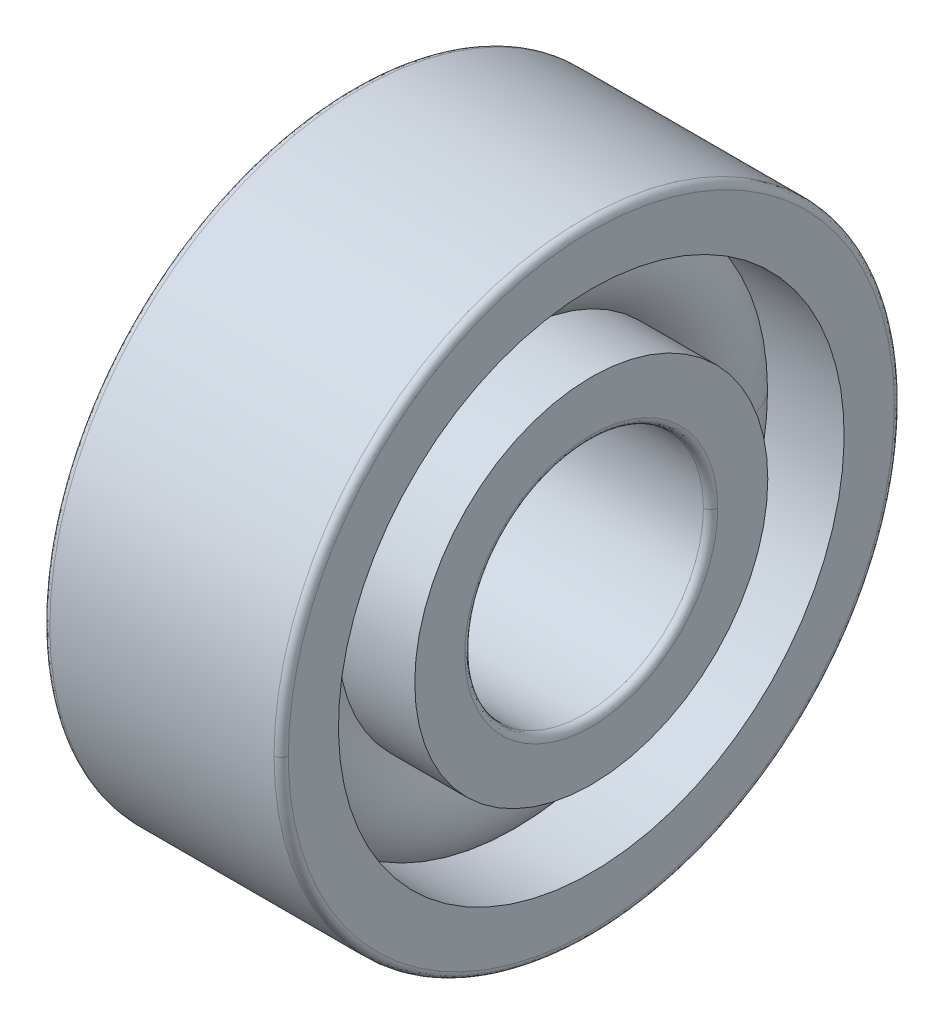
ISO-10303-21;
HEADER;
FILE_DESCRIPTION(('STEP AP214'),'2;1');
FILE_NAME('part.step','',(''),(''),'','','');
FILE_SCHEMA(('AUTOMOTIVE_DESIGN { 1 0 10303 214 1 1 1 1 }'));
ENDSEC;
DATA;
#1=APPLICATION_CONTEXT('core data for automotive mechanical design processes');
#2=APPLICATION_PROTOCOL_DEFINITION('international standard','automotive_design',2000,#1);
#3=PRODUCT_CONTEXT('',#1,'mechanical');
#4=PRODUCT('Part','Part','',(#3));
#5=PRODUCT_RELATED_PRODUCT_CATEGORY('part','',(#4));
#6=PRODUCT_DEFINITION_FORMATION('','',#4);
#7=PRODUCT_DEFINITION_CONTEXT('part definition',#1,'design');
#8=PRODUCT_DEFINITION('design','',#6,#7);
#9=PRODUCT_DEFINITION_SHAPE('','',#8);
#10=(LENGTH_UNIT() NAMED_UNIT(*) SI_UNIT(.MILLI.,.METRE.));
#11=(NAMED_UNIT(*) PLANE_ANGLE_UNIT() SI_UNIT($,.RADIAN.));
#12=(NAMED_UNIT(*) SI_UNIT($,.STERADIAN.) SOLID_ANGLE_UNIT());
#13=UNCERTAINTY_MEASURE_WITH_UNIT(LENGTH_MEASURE(1.E-05),#10,'distance_accuracy_value','');
#14=(GEOMETRIC_REPRESENTATION_CONTEXT(3) GLOBAL_UNCERTAINTY_ASSIGNED_CONTEXT((#13)) GLOBAL_UNIT_ASSIGNED_CONTEXT((#10,
#11,#12)) REPRESENTATION_CONTEXT('',''));
#15=CARTESIAN_POINT('',(0.,0.,0.));
#16=DIRECTION('',(0.,0.,1.));
#17=DIRECTION('',(1.,0.,0.));
#18=AXIS2_PLACEMENT_3D('',#15,#16,#17);
#19=CARTESIAN_POINT('',(4.670049975,0.,-5.00149875));
#20=CARTESIAN_POINT('',(4.670049975,10.002997501,-5.00149875));
#21=CARTESIAN_POINT('',(4.670049975,10.002997501,5.00149875));
#22=CARTESIAN_POINT('',(4.670049975,0.,5.00149875));
#23=CARTESIAN_POINT('',(4.87401613,0.,-4.981033873));
#24=CARTESIAN_POINT('',(4.87401613,9.962067746,-4.981033873));
#25=CARTESIAN_POINT('',(4.87401613,9.962067746,4.981033873));
#26=CARTESIAN_POINT('',(4.87401613,0.,4.981033873));
#27=CARTESIAN_POINT('',(5.018966127,0.,-5.12598387));
#28=CARTESIAN_POINT('',(5.018966127,10.251967741,-5.12598387));
#29=CARTESIAN_POINT('',(5.018966127,10.251967741,5.12598387));
#30=CARTESIAN_POINT('',(5.018966127,0.,5.12598387));
#31=CARTESIAN_POINT('',(4.99850125,0.,-5.329950025));
#32=CARTESIAN_POINT('',(4.99850125,10.65990005,-5.329950025));
#33=CARTESIAN_POINT('',(4.99850125,10.65990005,5.329950025));
#34=CARTESIAN_POINT('',(4.99850125,0.,5.329950025));
#35=(BOUNDED_SURFACE() B_SPLINE_SURFACE(3,3,((#19,#20,#21,#22),(#23,#24,#25,#26),(#27,#28,#29,
#30),(#31,#32,#33,#34)),.UNSPECIFIED.,.F.,.F.,.F.) B_SPLINE_SURFACE_WITH_KNOTS((4,4),(4,4),(0.,
1.),(0.,1.),.UNSPECIFIED.) GEOMETRIC_REPRESENTATION_ITEM() RATIONAL_B_SPLINE_SURFACE(((1.,
0.333333333333333,0.333333333333333,1.),(0.755320871117971,0.25177362370599,0.25177362370599,
0.755320871117971),(0.755320871117971,0.25177362370599,0.25177362370599,0.755320871117971),(1.,
0.333333333333333,0.333333333333333,1.))) REPRESENTATION_ITEM('') SURFACE());
#36=CARTESIAN_POINT('',(4.7,0.,0.));
#37=DIRECTION('',(1.,0.,0.));
#38=DIRECTION('',(0.,0.,-1.));
#39=AXIS2_PLACEMENT_3D('',#36,#37,#38);
#40=CIRCLE('',#39,5.);
#41=CARTESIAN_POINT('',(4.70000000004814,-6.73452213215498E-10,-4.99999999990353));
#42=VERTEX_POINT('',#41);
#43=CARTESIAN_POINT('',(4.70000000004814,-1.53827571386498E-09,4.99999999990353));
#44=VERTEX_POINT('',#43);
#45=EDGE_CURVE('E718',#42,#44,#40,.T.);
#46=CARTESIAN_POINT('',(4.670049975,0.,-5.00149875));
#47=CARTESIAN_POINT('',(4.87401613,0.,-4.981033873));
#48=CARTESIAN_POINT('',(5.018966127,0.,-5.12598387));
#49=CARTESIAN_POINT('',(4.99850125,0.,-5.329950025));
#50=(BOUNDED_CURVE() B_SPLINE_CURVE(3,(#46,#47,#48,#49),.UNSPECIFIED.,.F.,
.F.) B_SPLINE_CURVE_WITH_KNOTS((4,4),(0.,1.),
.UNSPECIFIED.) CURVE() GEOMETRIC_REPRESENTATION_ITEM() RATIONAL_B_SPLINE_CURVE((1.,
0.755320871117971,0.755320871117971,1.)) REPRESENTATION_ITEM(''));
#51=CARTESIAN_POINT('',(5.00000000023152,0.,-5.30000000043888));
#52=VERTEX_POINT('',#51);
#53=EDGE_CURVE('E108',#52,#42,#50,.F.);
#54=CARTESIAN_POINT('',(5.00000000038587,0.,-5.29999999977427));
#55=CARTESIAN_POINT('',(5.00000000038587,10.5999999996801,-5.29999999977427));
#56=CARTESIAN_POINT('',(5.00000000038587,10.5999999996801,5.29999999977427));
#57=CARTESIAN_POINT('',(5.00000000038587,0.,5.29999999977427));
#58=(BOUNDED_CURVE() B_SPLINE_CURVE(3,(#54,#55,#56,#57),.UNSPECIFIED.,.F.,
.F.) B_SPLINE_CURVE_WITH_KNOTS((4,4),(0.,1.),
.UNSPECIFIED.) CURVE() GEOMETRIC_REPRESENTATION_ITEM() RATIONAL_B_SPLINE_CURVE((0.956578302122204,
0.318859434040735,0.318859434040735,0.956578302122204)) REPRESENTATION_ITEM(''));
#59=CARTESIAN_POINT('',(5.00000000023152,0.,5.30000000043888));
#60=VERTEX_POINT('',#59);
#61=EDGE_CURVE('E102',#60,#52,#58,.F.);
#62=CARTESIAN_POINT('',(4.670049975,0.,5.00149875));
#63=CARTESIAN_POINT('',(4.87401613,0.,4.981033873));
#64=CARTESIAN_POINT('',(5.018966127,0.,5.12598387));
#65=CARTESIAN_POINT('',(4.99850125,0.,5.329950025));
#66=(BOUNDED_CURVE() B_SPLINE_CURVE(3,(#62,#63,#64,#65),.UNSPECIFIED.,.F.,
.F.) B_SPLINE_CURVE_WITH_KNOTS((4,4),(0.,1.),
.UNSPECIFIED.) CURVE() GEOMETRIC_REPRESENTATION_ITEM() RATIONAL_B_SPLINE_CURVE((1.,
0.755320871117971,0.755320871117971,1.)) REPRESENTATION_ITEM(''));
#67=EDGE_CURVE('E105',#44,#60,#66,.T.);
#68=ORIENTED_EDGE('',*,*,#45,.F.);
#69=ORIENTED_EDGE('',*,*,#53,.F.);
#70=ORIENTED_EDGE('',*,*,#61,.F.);
#71=ORIENTED_EDGE('',*,*,#67,.F.);
#72=EDGE_LOOP('',(#68,#69,#70,#71));
#73=FACE_BOUND('',#72,.T.);
#74=ADVANCED_FACE('F16',(#73),#35,.T.);
#75=CARTESIAN_POINT('',(4.670049975,0.,5.00149875));
#76=CARTESIAN_POINT('',(4.670049975,-10.002997501,5.00149875));
#77=CARTESIAN_POINT('',(4.670049975,-10.002997501,-5.00149875));
#78=CARTESIAN_POINT('',(4.670049975,0.,-5.00149875));
#79=CARTESIAN_POINT('',(4.87401613,0.,4.981033873));
#80=CARTESIAN_POINT('',(4.87401613,-9.962067746,4.981033873));
#81=CARTESIAN_POINT('',(4.87401613,-9.962067746,-4.981033873));
#82=CARTESIAN_POINT('',(4.87401613,0.,-4.981033873));
#83=CARTESIAN_POINT('',(5.018966127,0.,5.12598387));
#84=CARTESIAN_POINT('',(5.018966127,-10.251967741,5.12598387));
#85=CARTESIAN_POINT('',(5.018966127,-10.251967741,-5.12598387));
#86=CARTESIAN_POINT('',(5.018966127,0.,-5.12598387));
#87=CARTESIAN_POINT('',(4.99850125,0.,5.329950025));
#88=CARTESIAN_POINT('',(4.99850125,-10.65990005,5.329950025));
#89=CARTESIAN_POINT('',(4.99850125,-10.65990005,-5.329950025));
#90=CARTESIAN_POINT('',(4.99850125,0.,-5.329950025));
#91=(BOUNDED_SURFACE() B_SPLINE_SURFACE(3,3,((#75,#76,#77,#78),(#79,#80,#81,#82),(#83,#84,#85,
#86),(#87,#88,#89,#90)),.UNSPECIFIED.,.F.,.F.,.F.) B_SPLINE_SURFACE_WITH_KNOTS((4,4),(4,4),(0.,
1.),(0.,1.),.UNSPECIFIED.) GEOMETRIC_REPRESENTATION_ITEM() RATIONAL_B_SPLINE_SURFACE(((1.,
0.333333333333333,0.333333333333333,1.),(0.755320871117971,0.25177362370599,0.25177362370599,
0.755320871117971),(0.755320871117971,0.25177362370599,0.25177362370599,0.755320871117971),(1.,
0.333333333333333,0.333333333333333,1.))) REPRESENTATION_ITEM('') SURFACE());
#92=CARTESIAN_POINT('',(4.7,0.,0.));
#93=DIRECTION('',(1.,0.,0.));
#94=DIRECTION('',(0.,0.,-1.));
#95=AXIS2_PLACEMENT_3D('',#92,#93,#94);
#96=CIRCLE('',#95,5.);
#97=EDGE_CURVE('E114',#44,#42,#96,.T.);
#98=CARTESIAN_POINT('',(5.00000000038587,0.,5.29999999977428));
#99=CARTESIAN_POINT('',(5.00000000038587,-10.5999999996801,5.29999999977428));
#100=CARTESIAN_POINT('',(5.00000000038587,-10.5999999996801,-5.29999999977428));
#101=CARTESIAN_POINT('',(5.00000000038587,0.,-5.29999999977428));
#102=(BOUNDED_CURVE() B_SPLINE_CURVE(3,(#98,#99,#100,#101),.UNSPECIFIED.,.F.,
.F.) B_SPLINE_CURVE_WITH_KNOTS((4,4),(0.,1.),
.UNSPECIFIED.) CURVE() GEOMETRIC_REPRESENTATION_ITEM() RATIONAL_B_SPLINE_CURVE((0.956578302122207,
0.318859434040735,0.318859434040735,0.956578302122207)) REPRESENTATION_ITEM(''));
#103=EDGE_CURVE('E113',#52,#60,#102,.F.);
#104=ORIENTED_EDGE('',*,*,#53,.T.);
#105=ORIENTED_EDGE('',*,*,#97,.F.);
#106=ORIENTED_EDGE('',*,*,#67,.T.);
#107=ORIENTED_EDGE('',*,*,#103,.F.);
#108=EDGE_LOOP('',(#104,#105,#106,#107));
#109=FACE_BOUND('',#108,.T.);
#110=ADVANCED_FACE('F119',(#109),#91,.T.);
#111=CARTESIAN_POINT('',(-4.7,0.,0.));
#112=DIRECTION('',(1.,0.,0.));
#113=DIRECTION('',(0.,0.,-1.));
#114=AXIS2_PLACEMENT_3D('',#111,#112,#113);
#115=CYLINDRICAL_SURFACE('',#114,5.);
#116=ORIENTED_EDGE('',*,*,#45,.T.);
#117=ORIENTED_EDGE('',*,*,#97,.T.);
#118=EDGE_LOOP('',(#116,#117));
#119=FACE_BOUND('',#118,.T.);
#120=CARTESIAN_POINT('',(-4.70000000019257,0.,0.));
#121=DIRECTION('',(1.,0.,0.));
#122=DIRECTION('',(0.,0.,-1.));
#123=AXIS2_PLACEMENT_3D('',#120,#121,#122);
#124=CIRCLE('',#123,4.99999999961413);
#125=CARTESIAN_POINT('',(-4.70000000019257,-5.12758571288328E-10,4.9999999997106));
#126=VERTEX_POINT('',#125);
#127=CARTESIAN_POINT('',(-4.70000000014443,-2.24484071071833E-10,-4.9999999997106));
#128=VERTEX_POINT('',#127);
#129=EDGE_CURVE('E324',#126,#128,#124,.T.);
#130=ORIENTED_EDGE('',*,*,#129,.F.);
#131=CARTESIAN_POINT('',(-4.70000000019257,0.,0.));
#132=DIRECTION('',(1.,0.,0.));
#133=DIRECTION('',(0.,0.,-1.));
#134=AXIS2_PLACEMENT_3D('',#131,#132,#133);
#135=CIRCLE('',#134,4.99999999961413);
#136=EDGE_CURVE('E126',#128,#126,#135,.T.);
#137=ORIENTED_EDGE('',*,*,#136,.F.);
#138=EDGE_LOOP('',(#130,#137));
#139=FACE_BOUND('',#138,.T.);
#140=ADVANCED_FACE('F147',(#119,#139),#115,.F.);
#141=CARTESIAN_POINT('',(5.,-7.4888,7.4888));
#142=DIRECTION('',(1.,0.,0.));
#143=DIRECTION('',(0.,0.,-1.));
#144=AXIS2_PLACEMENT_3D('',#141,#142,#143);
#145=PLANE('',#144);
#146=ORIENTED_EDGE('',*,*,#61,.T.);
#147=ORIENTED_EDGE('',*,*,#103,.T.);
#148=EDGE_LOOP('',(#146,#147));
#149=FACE_BOUND('',#148,.T.);
#150=CARTESIAN_POINT('',(5.,0.,0.));
#151=DIRECTION('',(1.,0.,0.));
#152=DIRECTION('',(0.,1.,0.));
#153=AXIS2_PLACEMENT_3D('',#150,#151,#152);
#154=CIRCLE('',#153,7.4);
#155=CARTESIAN_POINT('',(5.,7.4,0.));
#156=VERTEX_POINT('',#155);
#157=EDGE_CURVE('E21',#156,#156,#154,.T.);
#158=ORIENTED_EDGE('',*,*,#157,.T.);
#159=EDGE_LOOP('',(#158));
#160=FACE_BOUND('',#159,.T.);
#161=ADVANCED_FACE('F124',(#149,#160),#145,.T.);
#162=CARTESIAN_POINT('',(-4.99850125,0.,-5.329950025));
#163=CARTESIAN_POINT('',(-4.99850125,10.65990005,-5.329950025));
#164=CARTESIAN_POINT('',(-4.99850125,10.65990005,5.329950025));
#165=CARTESIAN_POINT('',(-4.99850125,0.,5.329950025));
#166=CARTESIAN_POINT('',(-5.018966127,0.,-5.12598387));
#167=CARTESIAN_POINT('',(-5.018966127,10.251967741,-5.12598387));
#168=CARTESIAN_POINT('',(-5.018966127,10.251967741,5.12598387));
#169=CARTESIAN_POINT('',(-5.018966127,0.,5.12598387));
#170=CARTESIAN_POINT('',(-4.87401613,0.,-4.981033873));
#171=CARTESIAN_POINT('',(-4.87401613,9.962067746,-4.981033873));
#172=CARTESIAN_POINT('',(-4.87401613,9.962067746,4.981033873));
#173=CARTESIAN_POINT('',(-4.87401613,0.,4.981033873));
#174=CARTESIAN_POINT('',(-4.670049975,0.,-5.00149875));
#175=CARTESIAN_POINT('',(-4.670049975,10.002997501,-5.00149875));
#176=CARTESIAN_POINT('',(-4.670049975,10.002997501,5.00149875));
#177=CARTESIAN_POINT('',(-4.670049975,0.,5.00149875));
#178=(BOUNDED_SURFACE() B_SPLINE_SURFACE(3,3,((#162,#163,#164,#165),(#166,#167,#168,#169),(#170,
#171,#172,#173),(#174,#175,#176,#177)),.UNSPECIFIED.,.F.,.F.,
.F.) B_SPLINE_SURFACE_WITH_KNOTS((4,4),(4,4),(0.,1.),(0.,1.),
.UNSPECIFIED.) GEOMETRIC_REPRESENTATION_ITEM() RATIONAL_B_SPLINE_SURFACE(((1.,0.333333333333333,
0.333333333333333,1.),(0.755320871117971,0.25177362370599,0.25177362370599,0.755320871117971),
(0.755320871117971,0.25177362370599,0.25177362370599,0.755320871117971),(1.,0.333333333333333,
0.333333333333333,1.))) REPRESENTATION_ITEM('') SURFACE());
#179=CARTESIAN_POINT('',(-5.00000000038587,0.,5.29999999977428));
#180=CARTESIAN_POINT('',(-5.00000000038587,10.5999999996801,5.29999999977428));
#181=CARTESIAN_POINT('',(-5.00000000038587,10.5999999996801,-5.29999999977428));
#182=CARTESIAN_POINT('',(-5.00000000038587,0.,-5.29999999977428));
#183=(BOUNDED_CURVE() B_SPLINE_CURVE(3,(#179,#180,#181,#182),.UNSPECIFIED.,.F.,
.F.) B_SPLINE_CURVE_WITH_KNOTS((4,4),(0.,1.),
.UNSPECIFIED.) CURVE() GEOMETRIC_REPRESENTATION_ITEM() RATIONAL_B_SPLINE_CURVE((0.956578302122208,
0.318859434040736,0.318859434040736,0.956578302122208)) REPRESENTATION_ITEM(''));
#184=CARTESIAN_POINT('',(-5.00000000023152,0.,-5.30000000043888));
#185=VERTEX_POINT('',#184);
#186=CARTESIAN_POINT('',(-5.00000000023152,0.,5.30000000043888));
#187=VERTEX_POINT('',#186);
#188=EDGE_CURVE('E456',#185,#187,#183,.F.);
#189=CARTESIAN_POINT('',(-4.99850125,0.,-5.329950025));
#190=CARTESIAN_POINT('',(-5.018966127,0.,-5.12598387));
#191=CARTESIAN_POINT('',(-4.87401613,0.,-4.981033873));
#192=CARTESIAN_POINT('',(-4.670049975,0.,-5.00149875));
#193=(BOUNDED_CURVE() B_SPLINE_CURVE(3,(#189,#190,#191,#192),.UNSPECIFIED.,.F.,
.F.) B_SPLINE_CURVE_WITH_KNOTS((4,4),(0.,1.),
.UNSPECIFIED.) CURVE() GEOMETRIC_REPRESENTATION_ITEM() RATIONAL_B_SPLINE_CURVE((1.,
0.755320871117971,0.755320871117971,1.)) REPRESENTATION_ITEM(''));
#194=EDGE_CURVE('E278',#128,#185,#193,.F.);
#195=CARTESIAN_POINT('',(-4.99850125,0.,5.329950025));
#196=CARTESIAN_POINT('',(-5.018966127,0.,5.12598387));
#197=CARTESIAN_POINT('',(-4.87401613,0.,4.981033873));
#198=CARTESIAN_POINT('',(-4.670049975,0.,5.00149875));
#199=(BOUNDED_CURVE() B_SPLINE_CURVE(3,(#195,#196,#197,#198),.UNSPECIFIED.,.F.,
.F.) B_SPLINE_CURVE_WITH_KNOTS((4,4),(0.,1.),
.UNSPECIFIED.) CURVE() GEOMETRIC_REPRESENTATION_ITEM() RATIONAL_B_SPLINE_CURVE((1.,
0.755320871117971,0.755320871117971,1.)) REPRESENTATION_ITEM(''));
#200=EDGE_CURVE('E321',#187,#126,#199,.T.);
#201=ORIENTED_EDGE('',*,*,#188,.F.);
#202=ORIENTED_EDGE('',*,*,#194,.F.);
#203=ORIENTED_EDGE('',*,*,#136,.T.);
#204=ORIENTED_EDGE('',*,*,#200,.F.);
#205=EDGE_LOOP('',(#201,#202,#203,#204));
#206=FACE_BOUND('',#205,.T.);
#207=ADVANCED_FACE('F146',(#206),#178,.T.);
#208=CARTESIAN_POINT('',(-4.99850125,0.,5.329950025));
#209=CARTESIAN_POINT('',(-4.99850125,-10.65990005,5.329950025));
#210=CARTESIAN_POINT('',(-4.99850125,-10.65990005,-5.329950025));
#211=CARTESIAN_POINT('',(-4.99850125,0.,-5.329950025));
#212=CARTESIAN_POINT('',(-5.018966127,0.,5.12598387));
#213=CARTESIAN_POINT('',(-5.018966127,-10.251967741,5.12598387));
#214=CARTESIAN_POINT('',(-5.018966127,-10.251967741,-5.12598387));
#215=CARTESIAN_POINT('',(-5.018966127,0.,-5.12598387));
#216=CARTESIAN_POINT('',(-4.87401613,0.,4.981033873));
#217=CARTESIAN_POINT('',(-4.87401613,-9.962067746,4.981033873));
#218=CARTESIAN_POINT('',(-4.87401613,-9.962067746,-4.981033873));
#219=CARTESIAN_POINT('',(-4.87401613,0.,-4.981033873));
#220=CARTESIAN_POINT('',(-4.670049975,0.,5.00149875));
#221=CARTESIAN_POINT('',(-4.670049975,-10.002997501,5.00149875));
#222=CARTESIAN_POINT('',(-4.670049975,-10.002997501,-5.00149875));
#223=CARTESIAN_POINT('',(-4.670049975,0.,-5.00149875));
#224=(BOUNDED_SURFACE() B_SPLINE_SURFACE(3,3,((#208,#209,#210,#211),(#212,#213,#214,#215),(#216,
#217,#218,#219),(#220,#221,#222,#223)),.UNSPECIFIED.,.F.,.F.,
.F.) B_SPLINE_SURFACE_WITH_KNOTS((4,4),(4,4),(0.,1.),(0.,1.),
.UNSPECIFIED.) GEOMETRIC_REPRESENTATION_ITEM() RATIONAL_B_SPLINE_SURFACE(((1.,0.333333333333333,
0.333333333333333,1.),(0.755320871117971,0.25177362370599,0.25177362370599,0.755320871117971),
(0.755320871117971,0.25177362370599,0.25177362370599,0.755320871117971),(1.,0.333333333333333,
0.333333333333333,1.))) REPRESENTATION_ITEM('') SURFACE());
#225=CARTESIAN_POINT('',(-5.00000000038587,0.,-5.29999999977428));
#226=CARTESIAN_POINT('',(-5.00000000038587,-10.5999999996801,-5.29999999977428));
#227=CARTESIAN_POINT('',(-5.00000000038587,-10.5999999996801,5.29999999977428));
#228=CARTESIAN_POINT('',(-5.00000000038587,0.,5.29999999977428));
#229=(BOUNDED_CURVE() B_SPLINE_CURVE(3,(#225,#226,#227,#228),.UNSPECIFIED.,.F.,
.F.) B_SPLINE_CURVE_WITH_KNOTS((4,4),(0.,1.),
.UNSPECIFIED.) CURVE() GEOMETRIC_REPRESENTATION_ITEM() RATIONAL_B_SPLINE_CURVE((0.956578302122206,
0.318859434040735,0.318859434040735,0.956578302122206)) REPRESENTATION_ITEM(''));
#230=EDGE_CURVE('E264',#187,#185,#229,.F.);
#231=ORIENTED_EDGE('',*,*,#194,.T.);
#232=ORIENTED_EDGE('',*,*,#230,.F.);
#233=ORIENTED_EDGE('',*,*,#200,.T.);
#234=ORIENTED_EDGE('',*,*,#129,.T.);
#235=EDGE_LOOP('',(#231,#232,#233,#234));
#236=FACE_BOUND('',#235,.T.);
#237=ADVANCED_FACE('F280',(#236),#224,.T.);
#238=CARTESIAN_POINT('',(1.788854382,0.,0.));
#239=DIRECTION('',(1.,0.,0.));
#240=DIRECTION('',(0.,1.,0.));
#241=AXIS2_PLACEMENT_3D('',#238,#239,#240);
#242=CYLINDRICAL_SURFACE('',#241,7.4);
#243=CARTESIAN_POINT('',(1.78885438173406,0.,0.));
#244=DIRECTION('',(-1.,0.,0.));
#245=DIRECTION('',(0.,-1.,0.));
#246=AXIS2_PLACEMENT_3D('',#243,#244,#245);
#247=CIRCLE('',#246,7.39999999949192);
#248=CARTESIAN_POINT('',(1.78885438173406,-3.32236425186312E-10,-7.39999999961894));
#249=VERTEX_POINT('',#248);
#250=CARTESIAN_POINT('',(1.78885438180055,-7.58882685506725E-10,7.39999999961894));
#251=VERTEX_POINT('',#250);
#252=EDGE_CURVE('E240',#249,#251,#247,.T.);
#253=ORIENTED_EDGE('',*,*,#252,.F.);
#254=CARTESIAN_POINT('',(1.78885438173406,0.,0.));
#255=DIRECTION('',(-1.,0.,0.));
#256=DIRECTION('',(0.,-1.,0.));
#257=AXIS2_PLACEMENT_3D('',#254,#255,#256);
#258=CIRCLE('',#257,7.39999999949192);
#259=EDGE_CURVE('E259',#251,#249,#258,.T.);
#260=ORIENTED_EDGE('',*,*,#259,.F.);
#261=EDGE_LOOP('',(#253,#260));
#262=FACE_BOUND('',#261,.T.);
#263=ORIENTED_EDGE('',*,*,#157,.F.);
#264=EDGE_LOOP('',(#263));
#265=FACE_BOUND('',#264,.T.);
#266=ADVANCED_FACE('F157',(#262,#265),#242,.T.);
#267=CARTESIAN_POINT('',(-5.,-7.4888,-7.4888));
#268=DIRECTION('',(-1.,0.,0.));
#269=DIRECTION('',(0.,0.,1.));
#270=AXIS2_PLACEMENT_3D('',#267,#268,#269);
#271=PLANE('',#270);
#272=ORIENTED_EDGE('',*,*,#188,.T.);
#273=ORIENTED_EDGE('',*,*,#230,.T.);
#274=EDGE_LOOP('',(#272,#273));
#275=FACE_BOUND('',#274,.T.);
#276=CARTESIAN_POINT('',(-5.,0.,0.));
#277=DIRECTION('',(1.,0.,0.));
#278=DIRECTION('',(0.,1.,0.));
#279=AXIS2_PLACEMENT_3D('',#276,#277,#278);
#280=CIRCLE('',#279,7.4);
#281=CARTESIAN_POINT('',(-5.,7.4,0.));
#282=VERTEX_POINT('',#281);
#283=EDGE_CURVE('E230',#282,#282,#280,.F.);
#284=ORIENTED_EDGE('',*,*,#283,.T.);
#285=EDGE_LOOP('',(#284));
#286=FACE_BOUND('',#285,.T.);
#287=ADVANCED_FACE('F152',(#275,#286),#271,.T.);
#288=CARTESIAN_POINT('',(1.620184095,0.,10.770594109));
#289=CARTESIAN_POINT('',(1.620184095,21.541188219,10.770594109));
#290=CARTESIAN_POINT('',(1.620184095,21.541188219,-10.770594109));
#291=CARTESIAN_POINT('',(1.620184095,0.,-10.770594109));
#292=CARTESIAN_POINT('',(2.731814894,0.,9.753395119));
#293=CARTESIAN_POINT('',(2.731814894,19.506790238,9.753395119));
#294=CARTESIAN_POINT('',(2.731814894,19.506790238,-9.753395119));
#295=CARTESIAN_POINT('',(2.731814894,0.,-9.753395119));
#296=CARTESIAN_POINT('',(2.731814894,0.,8.246604881));
#297=CARTESIAN_POINT('',(2.731814894,16.493209762,8.246604881));
#298=CARTESIAN_POINT('',(2.731814894,16.493209762,-8.246604881));
#299=CARTESIAN_POINT('',(2.731814894,0.,-8.246604881));
#300=CARTESIAN_POINT('',(1.620184095,0.,7.229405891));
#301=CARTESIAN_POINT('',(1.620184095,14.458811781,7.229405891));
#302=CARTESIAN_POINT('',(1.620184095,14.458811781,-7.229405891));
#303=CARTESIAN_POINT('',(1.620184095,0.,-7.229405891));
#304=(BOUNDED_SURFACE() B_SPLINE_SURFACE(3,3,((#288,#289,#290,#291),(#292,#293,#294,#295),(#296,
#297,#298,#299),(#300,#301,#302,#303)),.UNSPECIFIED.,.F.,.F.,
.F.) B_SPLINE_SURFACE_WITH_KNOTS((4,4),(4,4),(0.,1.),(0.,1.),
.UNSPECIFIED.) GEOMETRIC_REPRESENTATION_ITEM() RATIONAL_B_SPLINE_SURFACE(((1.,0.333333333333333,
0.333333333333333,1.),(0.783384470702987,0.261128156900996,0.261128156900996,0.783384470702987),
(0.783384470702987,0.261128156900996,0.261128156900996,0.783384470702987),(1.,0.333333333333333,
0.333333333333333,1.))) REPRESENTATION_ITEM('') SURFACE());
#305=CARTESIAN_POINT('',(1.788854382,0.,0.));
#306=DIRECTION('',(1.,0.,0.));
#307=DIRECTION('',(0.,0.,-1.));
#308=AXIS2_PLACEMENT_3D('',#305,#306,#307);
#309=CIRCLE('',#308,10.6);
#310=CARTESIAN_POINT('',(1.78885438193351,-3.26114451339377E-09,10.600000000127));
#311=VERTEX_POINT('',#310);
#312=CARTESIAN_POINT('',(1.78885438193351,-1.42771869201686E-09,-10.600000000127));
#313=VERTEX_POINT('',#312);
#314=EDGE_CURVE('E232',#311,#313,#309,.F.);
#315=CARTESIAN_POINT('',(1.620184095,0.,10.770594109));
#316=CARTESIAN_POINT('',(2.731814894,0.,9.753395119));
#317=CARTESIAN_POINT('',(2.731814894,0.,8.246604881));
#318=CARTESIAN_POINT('',(1.620184095,0.,7.229405891));
#319=(BOUNDED_CURVE() B_SPLINE_CURVE(3,(#315,#316,#317,#318),.UNSPECIFIED.,.F.,
.F.) B_SPLINE_CURVE_WITH_KNOTS((4,4),(0.,1.),
.UNSPECIFIED.) CURVE() GEOMETRIC_REPRESENTATION_ITEM() RATIONAL_B_SPLINE_CURVE((1.,
0.783384470702987,0.783384470702987,1.)) REPRESENTATION_ITEM(''));
#320=EDGE_CURVE('E233',#251,#311,#319,.F.);
#321=CARTESIAN_POINT('',(1.620184095,0.,-10.770594109));
#322=CARTESIAN_POINT('',(2.731814894,0.,-9.753395119));
#323=CARTESIAN_POINT('',(2.731814894,0.,-8.246604881));
#324=CARTESIAN_POINT('',(1.620184095,0.,-7.229405891));
#325=(BOUNDED_CURVE() B_SPLINE_CURVE(3,(#321,#322,#323,#324),.UNSPECIFIED.,.F.,
.F.) B_SPLINE_CURVE_WITH_KNOTS((4,4),(0.,1.),
.UNSPECIFIED.) CURVE() GEOMETRIC_REPRESENTATION_ITEM() RATIONAL_B_SPLINE_CURVE((1.,
0.783384470702987,0.783384470702987,1.)) REPRESENTATION_ITEM(''));
#326=EDGE_CURVE('E247',#313,#249,#325,.T.);
#327=ORIENTED_EDGE('',*,*,#314,.F.);
#328=ORIENTED_EDGE('',*,*,#320,.F.);
#329=ORIENTED_EDGE('',*,*,#259,.T.);
#330=ORIENTED_EDGE('',*,*,#326,.F.);
#331=EDGE_LOOP('',(#327,#328,#329,#330));
#332=FACE_BOUND('',#331,.T.);
#333=ADVANCED_FACE('F156',(#332),#304,.T.);
#334=CARTESIAN_POINT('',(1.620184095,0.,-10.770594109));
#335=CARTESIAN_POINT('',(1.620184095,-21.541188219,-10.770594109));
#336=CARTESIAN_POINT('',(1.620184095,-21.541188219,10.770594109));
#337=CARTESIAN_POINT('',(1.620184095,0.,10.770594109));
#338=CARTESIAN_POINT('',(2.731814894,0.,-9.753395119));
#339=CARTESIAN_POINT('',(2.731814894,-19.506790238,-9.753395119));
#340=CARTESIAN_POINT('',(2.731814894,-19.506790238,9.753395119));
#341=CARTESIAN_POINT('',(2.731814894,0.,9.753395119));
#342=CARTESIAN_POINT('',(2.731814894,0.,-8.246604881));
#343=CARTESIAN_POINT('',(2.731814894,-16.493209762,-8.246604881));
#344=CARTESIAN_POINT('',(2.731814894,-16.493209762,8.246604881));
#345=CARTESIAN_POINT('',(2.731814894,0.,8.246604881));
#346=CARTESIAN_POINT('',(1.620184095,0.,-7.229405891));
#347=CARTESIAN_POINT('',(1.620184095,-14.458811781,-7.229405891));
#348=CARTESIAN_POINT('',(1.620184095,-14.458811781,7.229405891));
#349=CARTESIAN_POINT('',(1.620184095,0.,7.229405891));
#350=(BOUNDED_SURFACE() B_SPLINE_SURFACE(3,3,((#334,#335,#336,#337),(#338,#339,#340,#341),(#342,
#343,#344,#345),(#346,#347,#348,#349)),.UNSPECIFIED.,.F.,.F.,
.F.) B_SPLINE_SURFACE_WITH_KNOTS((4,4),(4,4),(0.,1.),(0.,1.),
.UNSPECIFIED.) GEOMETRIC_REPRESENTATION_ITEM() RATIONAL_B_SPLINE_SURFACE(((1.,0.333333333333333,
0.333333333333333,1.),(0.783384470702987,0.261128156900996,0.261128156900996,0.783384470702987),
(0.783384470702987,0.261128156900996,0.261128156900996,0.783384470702987),(1.,0.333333333333333,
0.333333333333333,1.))) REPRESENTATION_ITEM('') SURFACE());
#351=CARTESIAN_POINT('',(1.788854382,0.,0.));
#352=DIRECTION('',(1.,0.,0.));
#353=DIRECTION('',(0.,0.,-1.));
#354=AXIS2_PLACEMENT_3D('',#351,#352,#353);
#355=CIRCLE('',#354,10.6);
#356=EDGE_CURVE('E237',#313,#311,#355,.F.);
#357=ORIENTED_EDGE('',*,*,#320,.T.);
#358=ORIENTED_EDGE('',*,*,#356,.F.);
#359=ORIENTED_EDGE('',*,*,#326,.T.);
#360=ORIENTED_EDGE('',*,*,#252,.T.);
#361=EDGE_LOOP('',(#357,#358,#359,#360));
#362=FACE_BOUND('',#361,.T.);
#363=ADVANCED_FACE('F448',(#362),#350,.T.);
#364=CARTESIAN_POINT('',(-5.,0.,0.));
#365=DIRECTION('',(1.,0.,0.));
#366=DIRECTION('',(0.,1.,0.));
#367=AXIS2_PLACEMENT_3D('',#364,#365,#366);
#368=CYLINDRICAL_SURFACE('',#367,7.4);
#369=ORIENTED_EDGE('',*,*,#283,.F.);
#370=EDGE_LOOP('',(#369));
#371=FACE_BOUND('',#370,.T.);
#372=CARTESIAN_POINT('',(-1.78885438173406,0.,0.));
#373=DIRECTION('',(1.,0.,0.));
#374=DIRECTION('',(0.,1.,0.));
#375=AXIS2_PLACEMENT_3D('',#372,#373,#374);
#376=CIRCLE('',#375,7.39999999949192);
#377=CARTESIAN_POINT('',(-1.78885438173406,-4.98354637773766E-10,-7.39999999961894));
#378=VERTEX_POINT('',#377);
#379=CARTESIAN_POINT('',(-1.78885438173406,-7.58882685506725E-10,7.39999999961894));
#380=VERTEX_POINT('',#379);
#381=EDGE_CURVE('E428',#378,#380,#376,.T.);
#382=ORIENTED_EDGE('',*,*,#381,.F.);
#383=CARTESIAN_POINT('',(-1.78885438173406,0.,0.));
#384=DIRECTION('',(1.,0.,0.));
#385=DIRECTION('',(0.,1.,0.));
#386=AXIS2_PLACEMENT_3D('',#383,#384,#385);
#387=CIRCLE('',#386,7.39999999949192);
#388=EDGE_CURVE('E229',#380,#378,#387,.T.);
#389=ORIENTED_EDGE('',*,*,#388,.F.);
#390=EDGE_LOOP('',(#382,#389));
#391=FACE_BOUND('',#390,.T.);
#392=ADVANCED_FACE('F495',(#371,#391),#368,.T.);
#393=CARTESIAN_POINT('',(1.788854382,0.,0.));
#394=DIRECTION('',(1.,0.,0.));
#395=DIRECTION('',(0.,1.,0.));
#396=AXIS2_PLACEMENT_3D('',#393,#394,#395);
#397=CYLINDRICAL_SURFACE('',#396,10.6);
#398=CARTESIAN_POINT('',(5.,0.,0.));
#399=DIRECTION('',(1.,0.,0.));
#400=DIRECTION('',(0.,1.,0.));
#401=AXIS2_PLACEMENT_3D('',#398,#399,#400);
#402=CIRCLE('',#401,10.6);
#403=CARTESIAN_POINT('',(5.,10.6,0.));
#404=VERTEX_POINT('',#403);
#405=EDGE_CURVE('E227',#404,#404,#402,.F.);
#406=ORIENTED_EDGE('',*,*,#405,.F.);
#407=EDGE_LOOP('',(#406));
#408=FACE_BOUND('',#407,.T.);
#409=ORIENTED_EDGE('',*,*,#356,.T.);
#410=ORIENTED_EDGE('',*,*,#314,.T.);
#411=EDGE_LOOP('',(#409,#410));
#412=FACE_BOUND('',#411,.T.);
#413=ADVANCED_FACE('F502',(#408,#412),#397,.F.);
#414=CARTESIAN_POINT('',(-1.620184095,0.,7.229405891));
#415=CARTESIAN_POINT('',(-1.620184095,14.458811781,7.229405891));
#416=CARTESIAN_POINT('',(-1.620184095,14.458811781,-7.229405891));
#417=CARTESIAN_POINT('',(-1.620184095,0.,-7.229405891));
#418=CARTESIAN_POINT('',(-2.731814894,0.,8.246604881));
#419=CARTESIAN_POINT('',(-2.731814894,16.493209762,8.246604881));
#420=CARTESIAN_POINT('',(-2.731814894,16.493209762,-8.246604881));
#421=CARTESIAN_POINT('',(-2.731814894,0.,-8.246604881));
#422=CARTESIAN_POINT('',(-2.731814894,0.,9.753395119));
#423=CARTESIAN_POINT('',(-2.731814894,19.506790238,9.753395119));
#424=CARTESIAN_POINT('',(-2.731814894,19.506790238,-9.753395119));
#425=CARTESIAN_POINT('',(-2.731814894,0.,-9.753395119));
#426=CARTESIAN_POINT('',(-1.620184095,0.,10.770594109));
#427=CARTESIAN_POINT('',(-1.620184095,21.541188219,10.770594109));
#428=CARTESIAN_POINT('',(-1.620184095,21.541188219,-10.770594109));
#429=CARTESIAN_POINT('',(-1.620184095,0.,-10.770594109));
#430=(BOUNDED_SURFACE() B_SPLINE_SURFACE(3,3,((#414,#415,#416,#417),(#418,#419,#420,#421),(#422,
#423,#424,#425),(#426,#427,#428,#429)),.UNSPECIFIED.,.F.,.F.,
.F.) B_SPLINE_SURFACE_WITH_KNOTS((4,4),(4,4),(0.,1.),(0.,1.),
.UNSPECIFIED.) GEOMETRIC_REPRESENTATION_ITEM() RATIONAL_B_SPLINE_SURFACE(((1.,0.333333333333333,
0.333333333333333,1.),(0.783384470702987,0.261128156900996,0.261128156900996,0.783384470702987),
(0.783384470702987,0.261128156900996,0.261128156900996,0.783384470702987),(1.,0.333333333333333,
0.333333333333333,1.))) REPRESENTATION_ITEM('') SURFACE());
#431=CARTESIAN_POINT('',(-1.620184095,0.,7.229405891));
#432=CARTESIAN_POINT('',(-2.731814894,0.,8.246604881));
#433=CARTESIAN_POINT('',(-2.731814894,0.,9.753395119));
#434=CARTESIAN_POINT('',(-1.620184095,0.,10.770594109));
#435=(BOUNDED_CURVE() B_SPLINE_CURVE(3,(#431,#432,#433,#434),.UNSPECIFIED.,.F.,
.F.) B_SPLINE_CURVE_WITH_KNOTS((4,4),(0.,1.),
.UNSPECIFIED.) CURVE() GEOMETRIC_REPRESENTATION_ITEM() RATIONAL_B_SPLINE_CURVE((1.,
0.783384470702987,0.783384470702987,1.)) REPRESENTATION_ITEM(''));
#436=CARTESIAN_POINT('',(-1.78885438202618,-3.26114451339377E-09,10.6000000000234));
#437=VERTEX_POINT('',#436);
#438=EDGE_CURVE('E440',#437,#380,#435,.F.);
#439=CARTESIAN_POINT('',(-1.788854382,0.,0.));
#440=DIRECTION('',(1.,0.,0.));
#441=DIRECTION('',(0.,0.,-1.));
#442=AXIS2_PLACEMENT_3D('',#439,#440,#441);
#443=CIRCLE('',#442,10.6);
#444=CARTESIAN_POINT('',(-1.78885438193352,-1.42771869201686E-09,-10.600000000127));
#445=VERTEX_POINT('',#444);
#446=EDGE_CURVE('E618',#445,#437,#443,.T.);
#447=CARTESIAN_POINT('',(-1.620184095,0.,-7.229405891));
#448=CARTESIAN_POINT('',(-2.731814894,0.,-8.246604881));
#449=CARTESIAN_POINT('',(-2.731814894,0.,-9.753395119));
#450=CARTESIAN_POINT('',(-1.620184095,0.,-10.770594109));
#451=(BOUNDED_CURVE() B_SPLINE_CURVE(3,(#447,#448,#449,#450),.UNSPECIFIED.,.F.,
.F.) B_SPLINE_CURVE_WITH_KNOTS((4,4),(0.,1.),
.UNSPECIFIED.) CURVE() GEOMETRIC_REPRESENTATION_ITEM() RATIONAL_B_SPLINE_CURVE((1.,
0.783384470702987,0.783384470702987,1.)) REPRESENTATION_ITEM(''));
#452=EDGE_CURVE('E435',#378,#445,#451,.T.);
#453=ORIENTED_EDGE('',*,*,#381,.T.);
#454=ORIENTED_EDGE('',*,*,#438,.F.);
#455=ORIENTED_EDGE('',*,*,#446,.F.);
#456=ORIENTED_EDGE('',*,*,#452,.F.);
#457=EDGE_LOOP('',(#453,#454,#455,#456));
#458=FACE_BOUND('',#457,.T.);
#459=ADVANCED_FACE('F510',(#458),#430,.T.);
#460=CARTESIAN_POINT('',(-1.620184095,0.,-7.229405891));
#461=CARTESIAN_POINT('',(-1.620184095,-14.458811781,-7.229405891));
#462=CARTESIAN_POINT('',(-1.620184095,-14.458811781,7.229405891));
#463=CARTESIAN_POINT('',(-1.620184095,0.,7.229405891));
#464=CARTESIAN_POINT('',(-2.731814894,0.,-8.246604881));
#465=CARTESIAN_POINT('',(-2.731814894,-16.493209762,-8.246604881));
#466=CARTESIAN_POINT('',(-2.731814894,-16.493209762,8.246604881));
#467=CARTESIAN_POINT('',(-2.731814894,0.,8.246604881));
#468=CARTESIAN_POINT('',(-2.731814894,0.,-9.753395119));
#469=CARTESIAN_POINT('',(-2.731814894,-19.506790238,-9.753395119));
#470=CARTESIAN_POINT('',(-2.731814894,-19.506790238,9.753395119));
#471=CARTESIAN_POINT('',(-2.731814894,0.,9.753395119));
#472=CARTESIAN_POINT('',(-1.620184095,0.,-10.770594109));
#473=CARTESIAN_POINT('',(-1.620184095,-21.541188219,-10.770594109));
#474=CARTESIAN_POINT('',(-1.620184095,-21.541188219,10.770594109));
#475=CARTESIAN_POINT('',(-1.620184095,0.,10.770594109));
#476=(BOUNDED_SURFACE() B_SPLINE_SURFACE(3,3,((#460,#461,#462,#463),(#464,#465,#466,#467),(#468,
#469,#470,#471),(#472,#473,#474,#475)),.UNSPECIFIED.,.F.,.F.,
.F.) B_SPLINE_SURFACE_WITH_KNOTS((4,4),(4,4),(0.,1.),(0.,1.),
.UNSPECIFIED.) GEOMETRIC_REPRESENTATION_ITEM() RATIONAL_B_SPLINE_SURFACE(((1.,0.333333333333333,
0.333333333333333,1.),(0.783384470702987,0.261128156900996,0.261128156900996,0.783384470702987),
(0.783384470702987,0.261128156900996,0.261128156900996,0.783384470702987),(1.,0.333333333333333,
0.333333333333333,1.))) REPRESENTATION_ITEM('') SURFACE());
#477=CARTESIAN_POINT('',(-1.788854382,0.,0.));
#478=DIRECTION('',(1.,0.,0.));
#479=DIRECTION('',(0.,0.,-1.));
#480=AXIS2_PLACEMENT_3D('',#477,#478,#479);
#481=CIRCLE('',#480,10.6);
#482=EDGE_CURVE('E590',#437,#445,#481,.T.);
#483=ORIENTED_EDGE('',*,*,#438,.T.);
#484=ORIENTED_EDGE('',*,*,#388,.T.);
#485=ORIENTED_EDGE('',*,*,#452,.T.);
#486=ORIENTED_EDGE('',*,*,#482,.F.);
#487=EDGE_LOOP('',(#483,#484,#485,#486));
#488=FACE_BOUND('',#487,.T.);
#489=ADVANCED_FACE('F413',(#488),#476,.T.);
#490=CARTESIAN_POINT('',(5.,-12.8524,12.8524));
#491=DIRECTION('',(1.,0.,0.));
#492=DIRECTION('',(0.,0.,-1.));
#493=AXIS2_PLACEMENT_3D('',#490,#491,#492);
#494=PLANE('',#493);
#495=ORIENTED_EDGE('',*,*,#405,.T.);
#496=EDGE_LOOP('',(#495));
#497=FACE_BOUND('',#496,.T.);
#498=CARTESIAN_POINT('',(5.00000000038587,0.,12.7000000002257));
#499=CARTESIAN_POINT('',(5.00000000038587,25.4000000003199,12.7000000002257));
#500=CARTESIAN_POINT('',(5.00000000038587,25.4000000003199,-12.7000000002257));
#501=CARTESIAN_POINT('',(5.00000000038587,0.,-12.7000000002257));
#502=(BOUNDED_CURVE() B_SPLINE_CURVE(3,(#498,#499,#500,#501),.UNSPECIFIED.,.F.,
.F.) B_SPLINE_CURVE_WITH_KNOTS((4,4),(0.,1.),
.UNSPECIFIED.) CURVE() GEOMETRIC_REPRESENTATION_ITEM() RATIONAL_B_SPLINE_CURVE((0.95657830212221,
0.318859434040736,0.318859434040736,0.95657830212221)) REPRESENTATION_ITEM(''));
#503=CARTESIAN_POINT('',(5.00000000023152,0.,12.6999999976091));
#504=VERTEX_POINT('',#503);
#505=CARTESIAN_POINT('',(5.00000000023152,0.,-12.6999999976091));
#506=VERTEX_POINT('',#505);
#507=EDGE_CURVE('E179',#504,#506,#502,.T.);
#508=ORIENTED_EDGE('',*,*,#507,.F.);
#509=CARTESIAN_POINT('',(5.00000000038587,0.,-12.7000000002257));
#510=CARTESIAN_POINT('',(5.00000000038587,-25.4000000003199,-12.7000000002257));
#511=CARTESIAN_POINT('',(5.00000000038587,-25.4000000003199,12.7000000002257));
#512=CARTESIAN_POINT('',(5.00000000038587,0.,12.7000000002257));
#513=(BOUNDED_CURVE() B_SPLINE_CURVE(3,(#509,#510,#511,#512),.UNSPECIFIED.,.F.,
.F.) B_SPLINE_CURVE_WITH_KNOTS((4,4),(0.,1.),
.UNSPECIFIED.) CURVE() GEOMETRIC_REPRESENTATION_ITEM() RATIONAL_B_SPLINE_CURVE((0.956578302122207,
0.318859434040735,0.318859434040735,0.956578302122207)) REPRESENTATION_ITEM(''));
#514=EDGE_CURVE('E190',#506,#504,#513,.T.);
#515=ORIENTED_EDGE('',*,*,#514,.F.);
#516=EDGE_LOOP('',(#508,#515));
#517=FACE_BOUND('',#516,.T.);
#518=ADVANCED_FACE('F159',(#497,#517),#494,.T.);
#519=CARTESIAN_POINT('',(4.99850125,0.,12.670049975));
#520=CARTESIAN_POINT('',(4.99850125,-25.34009995,12.670049975));
#521=CARTESIAN_POINT('',(4.99850125,-25.34009995,-12.670049975));
#522=CARTESIAN_POINT('',(4.99850125,0.,-12.670049975));
#523=CARTESIAN_POINT('',(5.018966127,0.,12.87401613));
#524=CARTESIAN_POINT('',(5.018966127,-25.748032259,12.87401613));
#525=CARTESIAN_POINT('',(5.018966127,-25.748032259,-12.87401613));
#526=CARTESIAN_POINT('',(5.018966127,0.,-12.87401613));
#527=CARTESIAN_POINT('',(4.87401613,0.,13.018966127));
#528=CARTESIAN_POINT('',(4.87401613,-26.037932254,13.018966127));
#529=CARTESIAN_POINT('',(4.87401613,-26.037932254,-13.018966127));
#530=CARTESIAN_POINT('',(4.87401613,0.,-13.018966127));
#531=CARTESIAN_POINT('',(4.670049975,0.,12.99850125));
#532=CARTESIAN_POINT('',(4.670049975,-25.997002499,12.99850125));
#533=CARTESIAN_POINT('',(4.670049975,-25.997002499,-12.99850125));
#534=CARTESIAN_POINT('',(4.670049975,0.,-12.99850125));
#535=(BOUNDED_SURFACE() B_SPLINE_SURFACE(3,3,((#519,#520,#521,#522),(#523,#524,#525,#526),(#527,
#528,#529,#530),(#531,#532,#533,#534)),.UNSPECIFIED.,.F.,.F.,
.F.) B_SPLINE_SURFACE_WITH_KNOTS((4,4),(4,4),(0.,1.),(0.,1.),
.UNSPECIFIED.) GEOMETRIC_REPRESENTATION_ITEM() RATIONAL_B_SPLINE_SURFACE(((1.,0.333333333333333,
0.333333333333333,1.),(0.755320871117973,0.251773623705991,0.251773623705991,0.755320871117973),
(0.755320871117973,0.251773623705991,0.251773623705991,0.755320871117973),(1.,0.333333333333333,
0.333333333333333,1.))) REPRESENTATION_ITEM('') SURFACE());
#536=CARTESIAN_POINT('',(4.99850125,0.,-12.670049975));
#537=CARTESIAN_POINT('',(5.018966127,0.,-12.87401613));
#538=CARTESIAN_POINT('',(4.87401613,0.,-13.018966127));
#539=CARTESIAN_POINT('',(4.670049975,0.,-12.99850125));
#540=(BOUNDED_CURVE() B_SPLINE_CURVE(3,(#536,#537,#538,#539),.UNSPECIFIED.,.F.,
.F.) B_SPLINE_CURVE_WITH_KNOTS((4,4),(0.,1.),
.UNSPECIFIED.) CURVE() GEOMETRIC_REPRESENTATION_ITEM() RATIONAL_B_SPLINE_CURVE((1.,
0.755320871117973,0.755320871117973,1.)) REPRESENTATION_ITEM(''));
#541=CARTESIAN_POINT('',(4.70000000012036,-5.83658584786765E-10,-13.0000000002412));
#542=VERTEX_POINT('',#541);
#543=EDGE_CURVE('E595',#506,#542,#540,.T.);
#544=CARTESIAN_POINT('',(4.99850125,0.,12.670049975));
#545=CARTESIAN_POINT('',(5.018966127,0.,12.87401613));
#546=CARTESIAN_POINT('',(4.87401613,0.,13.018966127));
#547=CARTESIAN_POINT('',(4.670049975,0.,12.99850125));
#548=(BOUNDED_CURVE() B_SPLINE_CURVE(3,(#544,#545,#546,#547),.UNSPECIFIED.,.F.,
.F.) B_SPLINE_CURVE_WITH_KNOTS((4,4),(0.,1.),
.UNSPECIFIED.) CURVE() GEOMETRIC_REPRESENTATION_ITEM() RATIONAL_B_SPLINE_CURVE((1.,
0.755320871117973,0.755320871117973,1.)) REPRESENTATION_ITEM(''));
#549=CARTESIAN_POINT('',(4.70000000014443,0.,13.0000000003859));
#550=VERTEX_POINT('',#549);
#551=EDGE_CURVE('E583',#550,#504,#548,.F.);
#552=CARTESIAN_POINT('',(4.7,0.,0.));
#553=DIRECTION('',(1.,0.,0.));
#554=DIRECTION('',(0.,0.,-1.));
#555=AXIS2_PLACEMENT_3D('',#552,#553,#554);
#556=CIRCLE('',#555,13.);
#557=EDGE_CURVE('E601',#550,#542,#556,.T.);
#558=ORIENTED_EDGE('',*,*,#543,.F.);
#559=ORIENTED_EDGE('',*,*,#514,.T.);
#560=ORIENTED_EDGE('',*,*,#551,.F.);
#561=ORIENTED_EDGE('',*,*,#557,.T.);
#562=EDGE_LOOP('',(#558,#559,#560,#561));
#563=FACE_BOUND('',#562,.T.);
#564=ADVANCED_FACE('F401',(#563),#535,.T.);
#565=CARTESIAN_POINT('',(-4.670049975,0.,12.99850125));
#566=CARTESIAN_POINT('',(-4.670049975,-25.997002499,12.99850125));
#567=CARTESIAN_POINT('',(-4.670049975,-25.997002499,-12.99850125));
#568=CARTESIAN_POINT('',(-4.670049975,0.,-12.99850125));
#569=CARTESIAN_POINT('',(-4.87401613,0.,13.018966127));
#570=CARTESIAN_POINT('',(-4.87401613,-26.037932254,13.018966127));
#571=CARTESIAN_POINT('',(-4.87401613,-26.037932254,-13.018966127));
#572=CARTESIAN_POINT('',(-4.87401613,0.,-13.018966127));
#573=CARTESIAN_POINT('',(-5.018966127,0.,12.87401613));
#574=CARTESIAN_POINT('',(-5.018966127,-25.748032259,12.87401613));
#575=CARTESIAN_POINT('',(-5.018966127,-25.748032259,-12.87401613));
#576=CARTESIAN_POINT('',(-5.018966127,0.,-12.87401613));
#577=CARTESIAN_POINT('',(-4.99850125,0.,12.670049975));
#578=CARTESIAN_POINT('',(-4.99850125,-25.34009995,12.670049975));
#579=CARTESIAN_POINT('',(-4.99850125,-25.34009995,-12.670049975));
#580=CARTESIAN_POINT('',(-4.99850125,0.,-12.670049975));
#581=(BOUNDED_SURFACE() B_SPLINE_SURFACE(3,3,((#565,#566,#567,#568),(#569,#570,#571,#572),(#573,
#574,#575,#576),(#577,#578,#579,#580)),.UNSPECIFIED.,.F.,.F.,
.F.) B_SPLINE_SURFACE_WITH_KNOTS((4,4),(4,4),(0.,1.),(0.,1.),
.UNSPECIFIED.) GEOMETRIC_REPRESENTATION_ITEM() RATIONAL_B_SPLINE_SURFACE(((1.,0.333333333333333,
0.333333333333333,1.),(0.755320871117973,0.251773623705991,0.251773623705991,0.755320871117973),
(0.755320871117973,0.251773623705991,0.251773623705991,0.755320871117973),(1.,0.333333333333333,
0.333333333333333,1.))) REPRESENTATION_ITEM('') SURFACE());
#582=CARTESIAN_POINT('',(-4.670049975,0.,-12.99850125));
#583=CARTESIAN_POINT('',(-4.87401613,0.,-13.018966127));
#584=CARTESIAN_POINT('',(-5.018966127,0.,-12.87401613));
#585=CARTESIAN_POINT('',(-4.99850125,0.,-12.670049975));
#586=(BOUNDED_CURVE() B_SPLINE_CURVE(3,(#582,#583,#584,#585),.UNSPECIFIED.,.F.,
.F.) B_SPLINE_CURVE_WITH_KNOTS((4,4),(0.,1.),
.UNSPECIFIED.) CURVE() GEOMETRIC_REPRESENTATION_ITEM() RATIONAL_B_SPLINE_CURVE((1.,
0.755320871117973,0.755320871117973,1.)) REPRESENTATION_ITEM(''));
#587=CARTESIAN_POINT('',(-5.00000000023152,0.,-12.6999999976091));
#588=VERTEX_POINT('',#587);
#589=CARTESIAN_POINT('',(-4.70000000019257,0.,-13.0000000003859));
#590=VERTEX_POINT('',#589);
#591=EDGE_CURVE('E36',#588,#590,#586,.F.);
#592=CARTESIAN_POINT('',(-4.7,0.,0.));
#593=DIRECTION('',(1.,0.,0.));
#594=DIRECTION('',(0.,0.,-1.));
#595=AXIS2_PLACEMENT_3D('',#592,#593,#594);
#596=CIRCLE('',#595,13.);
#597=CARTESIAN_POINT('',(-4.70000000012638,-2.33305149935818E-09,13.0000000001929));
#598=VERTEX_POINT('',#597);
#599=EDGE_CURVE('E615',#590,#598,#596,.F.);
#600=CARTESIAN_POINT('',(-4.670049975,0.,12.99850125));
#601=CARTESIAN_POINT('',(-4.87401613,0.,13.018966127));
#602=CARTESIAN_POINT('',(-5.018966127,0.,12.87401613));
#603=CARTESIAN_POINT('',(-4.99850125,0.,12.670049975));
#604=(BOUNDED_CURVE() B_SPLINE_CURVE(3,(#600,#601,#602,#603),.UNSPECIFIED.,.F.,
.F.) B_SPLINE_CURVE_WITH_KNOTS((4,4),(0.,1.),
.UNSPECIFIED.) CURVE() GEOMETRIC_REPRESENTATION_ITEM() RATIONAL_B_SPLINE_CURVE((1.,
0.755320871117973,0.755320871117973,1.)) REPRESENTATION_ITEM(''));
#605=CARTESIAN_POINT('',(-5.00000000023152,0.,12.6999999976091));
#606=VERTEX_POINT('',#605);
#607=EDGE_CURVE('E386',#598,#606,#604,.T.);
#608=CARTESIAN_POINT('',(-5.00000000038587,0.,12.7000000002257));
#609=CARTESIAN_POINT('',(-5.00000000038587,-25.4000000003199,12.7000000002257));
#610=CARTESIAN_POINT('',(-5.00000000038587,-25.4000000003199,-12.7000000002257));
#611=CARTESIAN_POINT('',(-5.00000000038587,0.,-12.7000000002257));
#612=(BOUNDED_CURVE() B_SPLINE_CURVE(3,(#608,#609,#610,#611),.UNSPECIFIED.,.F.,
.F.) B_SPLINE_CURVE_WITH_KNOTS((4,4),(0.,1.),
.UNSPECIFIED.) CURVE() GEOMETRIC_REPRESENTATION_ITEM() RATIONAL_B_SPLINE_CURVE((0.956578302122211,
0.318859434040737,0.318859434040737,0.956578302122211)) REPRESENTATION_ITEM(''));
#613=EDGE_CURVE('E214',#588,#606,#612,.F.);
#614=ORIENTED_EDGE('',*,*,#591,.T.);
#615=ORIENTED_EDGE('',*,*,#599,.T.);
#616=ORIENTED_EDGE('',*,*,#607,.T.);
#617=ORIENTED_EDGE('',*,*,#613,.F.);
#618=EDGE_LOOP('',(#614,#615,#616,#617));
#619=FACE_BOUND('',#618,.T.);
#620=ADVANCED_FACE('F388',(#619),#581,.T.);
#621=CARTESIAN_POINT('',(-5.,0.,0.));
#622=DIRECTION('',(1.,0.,0.));
#623=DIRECTION('',(0.,1.,0.));
#624=AXIS2_PLACEMENT_3D('',#621,#622,#623);
#625=CYLINDRICAL_SURFACE('',#624,10.6);
#626=ORIENTED_EDGE('',*,*,#446,.T.);
#627=ORIENTED_EDGE('',*,*,#482,.T.);
#628=EDGE_LOOP('',(#626,#627));
#629=FACE_BOUND('',#628,.T.);
#630=CARTESIAN_POINT('',(-5.,0.,0.));
#631=DIRECTION('',(1.,0.,0.));
#632=DIRECTION('',(0.,1.,0.));
#633=AXIS2_PLACEMENT_3D('',#630,#631,#632);
#634=CIRCLE('',#633,10.6);
#635=CARTESIAN_POINT('',(-5.,10.6,0.));
#636=VERTEX_POINT('',#635);
#637=EDGE_CURVE('E218',#636,#636,#634,.T.);
#638=ORIENTED_EDGE('',*,*,#637,.F.);
#639=EDGE_LOOP('',(#638));
#640=FACE_BOUND('',#639,.T.);
#641=ADVANCED_FACE('F400',(#629,#640),#625,.F.);
#642=CARTESIAN_POINT('',(4.99850125,0.,-12.670049975));
#643=CARTESIAN_POINT('',(4.99850125,25.34009995,-12.670049975));
#644=CARTESIAN_POINT('',(4.99850125,25.34009995,12.670049975));
#645=CARTESIAN_POINT('',(4.99850125,0.,12.670049975));
#646=CARTESIAN_POINT('',(5.018966127,0.,-12.87401613));
#647=CARTESIAN_POINT('',(5.018966127,25.748032259,-12.87401613));
#648=CARTESIAN_POINT('',(5.018966127,25.748032259,12.87401613));
#649=CARTESIAN_POINT('',(5.018966127,0.,12.87401613));
#650=CARTESIAN_POINT('',(4.87401613,0.,-13.018966127));
#651=CARTESIAN_POINT('',(4.87401613,26.037932254,-13.018966127));
#652=CARTESIAN_POINT('',(4.87401613,26.037932254,13.018966127));
#653=CARTESIAN_POINT('',(4.87401613,0.,13.018966127));
#654=CARTESIAN_POINT('',(4.670049975,0.,-12.99850125));
#655=CARTESIAN_POINT('',(4.670049975,25.997002499,-12.99850125));
#656=CARTESIAN_POINT('',(4.670049975,25.997002499,12.99850125));
#657=CARTESIAN_POINT('',(4.670049975,0.,12.99850125));
#658=(BOUNDED_SURFACE() B_SPLINE_SURFACE(3,3,((#642,#643,#644,#645),(#646,#647,#648,#649),(#650,
#651,#652,#653),(#654,#655,#656,#657)),.UNSPECIFIED.,.F.,.F.,
.F.) B_SPLINE_SURFACE_WITH_KNOTS((4,4),(4,4),(0.,1.),(0.,1.),
.UNSPECIFIED.) GEOMETRIC_REPRESENTATION_ITEM() RATIONAL_B_SPLINE_SURFACE(((1.,0.333333333333333,
0.333333333333333,1.),(0.755320871117973,0.251773623705991,0.251773623705991,0.755320871117973),
(0.755320871117973,0.251773623705991,0.251773623705991,0.755320871117973),(1.,0.333333333333333,
0.333333333333333,1.))) REPRESENTATION_ITEM('') SURFACE());
#659=CARTESIAN_POINT('',(4.7,0.,0.));
#660=DIRECTION('',(1.,0.,0.));
#661=DIRECTION('',(0.,0.,-1.));
#662=AXIS2_PLACEMENT_3D('',#659,#660,#661);
#663=CIRCLE('',#662,13.);
#664=EDGE_CURVE('E226',#542,#550,#663,.T.);
#665=ORIENTED_EDGE('',*,*,#507,.T.);
#666=ORIENTED_EDGE('',*,*,#543,.T.);
#667=ORIENTED_EDGE('',*,*,#664,.T.);
#668=ORIENTED_EDGE('',*,*,#551,.T.);
#669=EDGE_LOOP('',(#665,#666,#667,#668));
#670=FACE_BOUND('',#669,.T.);
#671=ADVANCED_FACE('F544',(#670),#658,.T.);
#672=CARTESIAN_POINT('',(-5.,-12.8524,-12.8524));
#673=DIRECTION('',(-1.,0.,0.));
#674=DIRECTION('',(0.,0.,1.));
#675=AXIS2_PLACEMENT_3D('',#672,#673,#674);
#676=PLANE('',#675);
#677=ORIENTED_EDGE('',*,*,#637,.T.);
#678=EDGE_LOOP('',(#677));
#679=FACE_BOUND('',#678,.T.);
#680=CARTESIAN_POINT('',(-5.00000000038587,0.,-12.7000000002257));
#681=CARTESIAN_POINT('',(-5.00000000038587,25.4000000003199,-12.7000000002257));
#682=CARTESIAN_POINT('',(-5.00000000038587,25.4000000003199,12.7000000002257));
#683=CARTESIAN_POINT('',(-5.00000000038587,0.,12.7000000002257));
#684=(BOUNDED_CURVE() B_SPLINE_CURVE(3,(#680,#681,#682,#683),.UNSPECIFIED.,.F.,
.F.) B_SPLINE_CURVE_WITH_KNOTS((4,4),(0.,1.),
.UNSPECIFIED.) CURVE() GEOMETRIC_REPRESENTATION_ITEM() RATIONAL_B_SPLINE_CURVE((0.95657830212221,
0.318859434040737,0.318859434040737,0.95657830212221)) REPRESENTATION_ITEM(''));
#685=EDGE_CURVE('E27',#588,#606,#684,.T.);
#686=ORIENTED_EDGE('',*,*,#685,.F.);
#687=ORIENTED_EDGE('',*,*,#613,.T.);
#688=EDGE_LOOP('',(#686,#687));
#689=FACE_BOUND('',#688,.T.);
#690=ADVANCED_FACE('F18',(#679,#689),#676,.T.);
#691=CARTESIAN_POINT('',(-4.7,0.,0.));
#692=DIRECTION('',(1.,0.,0.));
#693=DIRECTION('',(0.,0.,-1.));
#694=AXIS2_PLACEMENT_3D('',#691,#692,#693);
#695=CYLINDRICAL_SURFACE('',#694,13.);
#696=ORIENTED_EDGE('',*,*,#664,.F.);
#697=ORIENTED_EDGE('',*,*,#557,.F.);
#698=EDGE_LOOP('',(#696,#697));
#699=FACE_BOUND('',#698,.T.);
#700=CARTESIAN_POINT('',(-4.70000000019257,0.,0.));
#701=DIRECTION('',(-1.,0.,0.));
#702=DIRECTION('',(0.,-1.,0.));
#703=AXIS2_PLACEMENT_3D('',#700,#701,#702);
#704=CIRCLE('',#703,13.0000000003859);
#705=EDGE_CURVE('E10',#598,#590,#704,.T.);
#706=ORIENTED_EDGE('',*,*,#705,.F.);
#707=ORIENTED_EDGE('',*,*,#599,.F.);
#708=EDGE_LOOP('',(#706,#707));
#709=FACE_BOUND('',#708,.T.);
#710=ADVANCED_FACE('F354',(#699,#709),#695,.T.);
#711=CARTESIAN_POINT('',(-4.670049975,0.,-12.99850125));
#712=CARTESIAN_POINT('',(-4.670049975,25.997002499,-12.99850125));
#713=CARTESIAN_POINT('',(-4.670049975,25.997002499,12.99850125));
#714=CARTESIAN_POINT('',(-4.670049975,0.,12.99850125));
#715=CARTESIAN_POINT('',(-4.87401613,0.,-13.018966127));
#716=CARTESIAN_POINT('',(-4.87401613,26.037932254,-13.018966127));
#717=CARTESIAN_POINT('',(-4.87401613,26.037932254,13.018966127));
#718=CARTESIAN_POINT('',(-4.87401613,0.,13.018966127));
#719=CARTESIAN_POINT('',(-5.018966127,0.,-12.87401613));
#720=CARTESIAN_POINT('',(-5.018966127,25.748032259,-12.87401613));
#721=CARTESIAN_POINT('',(-5.018966127,25.748032259,12.87401613));
#722=CARTESIAN_POINT('',(-5.018966127,0.,12.87401613));
#723=CARTESIAN_POINT('',(-4.99850125,0.,-12.670049975));
#724=CARTESIAN_POINT('',(-4.99850125,25.34009995,-12.670049975));
#725=CARTESIAN_POINT('',(-4.99850125,25.34009995,12.670049975));
#726=CARTESIAN_POINT('',(-4.99850125,0.,12.670049975));
#727=(BOUNDED_SURFACE() B_SPLINE_SURFACE(3,3,((#711,#712,#713,#714),(#715,#716,#717,#718),(#719,
#720,#721,#722),(#723,#724,#725,#726)),.UNSPECIFIED.,.F.,.F.,
.F.) B_SPLINE_SURFACE_WITH_KNOTS((4,4),(4,4),(0.,1.),(0.,1.),
.UNSPECIFIED.) GEOMETRIC_REPRESENTATION_ITEM() RATIONAL_B_SPLINE_SURFACE(((1.,0.333333333333333,
0.333333333333333,1.),(0.755320871117973,0.251773623705991,0.251773623705991,0.755320871117973),
(0.755320871117973,0.251773623705991,0.251773623705991,0.755320871117973),(1.,0.333333333333333,
0.333333333333333,1.))) REPRESENTATION_ITEM('') SURFACE());
#728=ORIENTED_EDGE('',*,*,#705,.T.);
#729=ORIENTED_EDGE('',*,*,#591,.F.);
#730=ORIENTED_EDGE('',*,*,#685,.T.);
#731=ORIENTED_EDGE('',*,*,#607,.F.);
#732=EDGE_LOOP('',(#728,#729,#730,#731));
#733=FACE_BOUND('',#732,.T.);
#734=ADVANCED_FACE('F352',(#733),#727,.T.);
#735=CLOSED_SHELL('',(#74,#110,#140,#161,#207,#237,#266,#287,#333,#363,#392,#413,#459,#489,#518,
#564,#620,#641,#671,#690,#710,#734));
#736=MANIFOLD_SOLID_BREP('B1',#735);
#737=ADVANCED_BREP_SHAPE_REPRESENTATION('',(#18,#736),#14);
#738=SHAPE_DEFINITION_REPRESENTATION(#9,#737);
ENDSEC;
END-ISO-10303-21;
